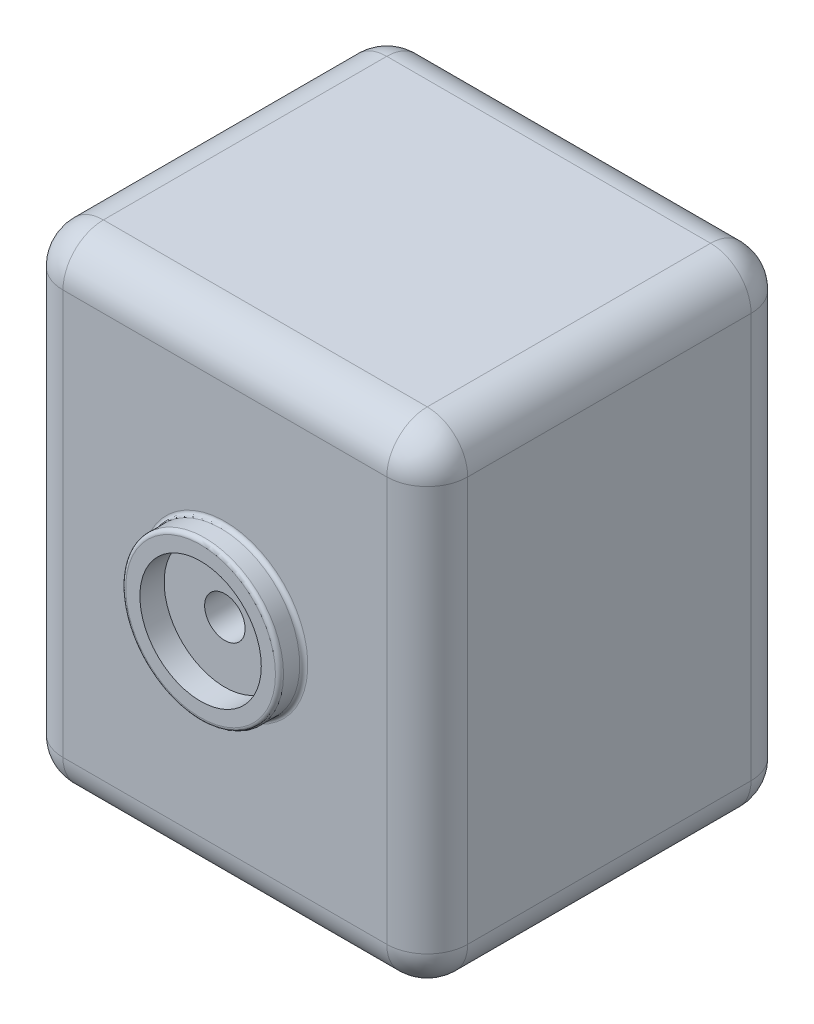
ISO-10303-21;
HEADER;
FILE_DESCRIPTION(('STEP AP214'),'2;1');
FILE_NAME('part.step','',(''),(''),'','','');
FILE_SCHEMA(('AUTOMOTIVE_DESIGN { 1 0 10303 214 1 1 1 1 }'));
ENDSEC;
DATA;
#1=APPLICATION_CONTEXT('core data for automotive mechanical design processes');
#2=APPLICATION_PROTOCOL_DEFINITION('international standard','automotive_design',2000,#1);
#3=PRODUCT_CONTEXT('',#1,'mechanical');
#4=PRODUCT('Part','Part','',(#3));
#5=PRODUCT_RELATED_PRODUCT_CATEGORY('part','',(#4));
#6=PRODUCT_DEFINITION_FORMATION('','',#4);
#7=PRODUCT_DEFINITION_CONTEXT('part definition',#1,'design');
#8=PRODUCT_DEFINITION('design','',#6,#7);
#9=PRODUCT_DEFINITION_SHAPE('','',#8);
#10=(LENGTH_UNIT() NAMED_UNIT(*) SI_UNIT(.MILLI.,.METRE.));
#11=(NAMED_UNIT(*) PLANE_ANGLE_UNIT() SI_UNIT($,.RADIAN.));
#12=(NAMED_UNIT(*) SI_UNIT($,.STERADIAN.) SOLID_ANGLE_UNIT());
#13=UNCERTAINTY_MEASURE_WITH_UNIT(LENGTH_MEASURE(1.E-05),#10,'distance_accuracy_value','');
#14=(GEOMETRIC_REPRESENTATION_CONTEXT(3) GLOBAL_UNCERTAINTY_ASSIGNED_CONTEXT((#13)) GLOBAL_UNIT_ASSIGNED_CONTEXT((#10,
#11,#12)) REPRESENTATION_CONTEXT('',''));
#15=CARTESIAN_POINT('',(0.,0.,0.));
#16=DIRECTION('',(0.,0.,1.));
#17=DIRECTION('',(1.,0.,0.));
#18=AXIS2_PLACEMENT_3D('',#15,#16,#17);
#19=CARTESIAN_POINT('',(0.,12.,0.));
#20=DIRECTION('',(0.,0.,-1.));
#21=DIRECTION('',(-1.,0.,0.));
#22=AXIS2_PLACEMENT_3D('',#19,#20,#21);
#23=PLANE('',#22);
#24=CARTESIAN_POINT('',(5.,6.,0.));
#25=DIRECTION('',(0.,0.,-1.));
#26=DIRECTION('',(-1.,0.,0.));
#27=AXIS2_PLACEMENT_3D('',#24,#25,#26);
#28=CIRCLE('',#27,2.05);
#29=CARTESIAN_POINT('',(2.95,6.,0.));
#30=VERTEX_POINT('',#29);
#31=EDGE_CURVE('E11',#30,#30,#28,.T.);
#32=ORIENTED_EDGE('',*,*,#31,.T.);
#33=EDGE_LOOP('',(#32));
#34=FACE_BOUND('',#33,.T.);
#35=DIRECTION('',(0.,-1.,0.));
#36=VECTOR('',#35,1.);
#37=CARTESIAN_POINT('',(1.,0.,0.));
#38=LINE('',#37,#36);
#39=CARTESIAN_POINT('',(1.,11.,0.));
#40=VERTEX_POINT('',#39);
#41=CARTESIAN_POINT('',(1.,1.,0.));
#42=VERTEX_POINT('',#41);
#43=EDGE_CURVE('E171',#40,#42,#38,.T.);
#44=ORIENTED_EDGE('',*,*,#43,.T.);
#45=DIRECTION('',(1.,0.,0.));
#46=VECTOR('',#45,1.);
#47=CARTESIAN_POINT('',(10.,1.,0.));
#48=LINE('',#47,#46);
#49=CARTESIAN_POINT('',(9.,1.,0.));
#50=VERTEX_POINT('',#49);
#51=EDGE_CURVE('E173',#42,#50,#48,.T.);
#52=ORIENTED_EDGE('',*,*,#51,.T.);
#53=DIRECTION('',(0.,1.,0.));
#54=VECTOR('',#53,1.);
#55=CARTESIAN_POINT('',(9.,12.,0.));
#56=LINE('',#55,#54);
#57=CARTESIAN_POINT('',(9.,11.,0.));
#58=VERTEX_POINT('',#57);
#59=EDGE_CURVE('E167',#50,#58,#56,.T.);
#60=ORIENTED_EDGE('',*,*,#59,.T.);
#61=DIRECTION('',(-1.,0.,0.));
#62=VECTOR('',#61,1.);
#63=CARTESIAN_POINT('',(0.,11.,0.));
#64=LINE('',#63,#62);
#65=EDGE_CURVE('E169',#58,#40,#64,.T.);
#66=ORIENTED_EDGE('',*,*,#65,.T.);
#67=EDGE_LOOP('',(#44,#52,#60,#66));
#68=FACE_BOUND('',#67,.T.);
#69=ADVANCED_FACE('F33',(#34,#68),#23,.F.);
#70=CARTESIAN_POINT('',(0.,0.,-9.));
#71=DIRECTION('',(-1.,0.,0.));
#72=DIRECTION('',(0.,0.,1.));
#73=AXIS2_PLACEMENT_3D('',#70,#71,#72);
#74=PLANE('',#73);
#75=DIRECTION('',(0.,-1.,0.));
#76=VECTOR('',#75,1.);
#77=CARTESIAN_POINT('',(0.,0.,-8.));
#78=LINE('',#77,#76);
#79=CARTESIAN_POINT('',(0.,11.,-8.));
#80=VERTEX_POINT('',#79);
#81=CARTESIAN_POINT('',(0.,1.,-8.));
#82=VERTEX_POINT('',#81);
#83=EDGE_CURVE('E180',#80,#82,#78,.T.);
#84=ORIENTED_EDGE('',*,*,#83,.T.);
#85=DIRECTION('',(0.,0.,1.));
#86=VECTOR('',#85,1.);
#87=CARTESIAN_POINT('',(0.,1.,-9.));
#88=LINE('',#87,#86);
#89=CARTESIAN_POINT('',(0.,1.,-1.));
#90=VERTEX_POINT('',#89);
#91=EDGE_CURVE('E182',#82,#90,#88,.T.);
#92=ORIENTED_EDGE('',*,*,#91,.T.);
#93=DIRECTION('',(0.,-1.,0.));
#94=VECTOR('',#93,1.);
#95=CARTESIAN_POINT('',(0.,12.,-1.));
#96=LINE('',#95,#94);
#97=CARTESIAN_POINT('',(0.,11.,-1.));
#98=VERTEX_POINT('',#97);
#99=EDGE_CURVE('E178',#90,#98,#96,.F.);
#100=ORIENTED_EDGE('',*,*,#99,.T.);
#101=DIRECTION('',(0.,0.,1.));
#102=VECTOR('',#101,1.);
#103=CARTESIAN_POINT('',(0.,11.,-9.));
#104=LINE('',#103,#102);
#105=EDGE_CURVE('E176',#98,#80,#104,.F.);
#106=ORIENTED_EDGE('',*,*,#105,.T.);
#107=EDGE_LOOP('',(#84,#92,#100,#106));
#108=FACE_BOUND('',#107,.T.);
#109=ADVANCED_FACE('F306',(#108),#74,.T.);
#110=CARTESIAN_POINT('',(0.,12.,-9.));
#111=DIRECTION('',(0.,1.,0.));
#112=DIRECTION('',(0.,0.,1.));
#113=AXIS2_PLACEMENT_3D('',#110,#111,#112);
#114=PLANE('',#113);
#115=DIRECTION('',(-1.,0.,0.));
#116=VECTOR('',#115,1.);
#117=CARTESIAN_POINT('',(0.,12.,-8.));
#118=LINE('',#117,#116);
#119=CARTESIAN_POINT('',(9.,12.,-8.));
#120=VERTEX_POINT('',#119);
#121=CARTESIAN_POINT('',(1.,12.,-8.));
#122=VERTEX_POINT('',#121);
#123=EDGE_CURVE('E189',#120,#122,#118,.T.);
#124=ORIENTED_EDGE('',*,*,#123,.T.);
#125=DIRECTION('',(0.,0.,1.));
#126=VECTOR('',#125,1.);
#127=CARTESIAN_POINT('',(1.,12.,-9.));
#128=LINE('',#127,#126);
#129=CARTESIAN_POINT('',(1.,12.,-1.));
#130=VERTEX_POINT('',#129);
#131=EDGE_CURVE('E191',#122,#130,#128,.T.);
#132=ORIENTED_EDGE('',*,*,#131,.T.);
#133=DIRECTION('',(-1.,0.,0.));
#134=VECTOR('',#133,1.);
#135=CARTESIAN_POINT('',(10.,12.,-1.));
#136=LINE('',#135,#134);
#137=CARTESIAN_POINT('',(9.,12.,-1.));
#138=VERTEX_POINT('',#137);
#139=EDGE_CURVE('E187',#130,#138,#136,.F.);
#140=ORIENTED_EDGE('',*,*,#139,.T.);
#141=DIRECTION('',(0.,0.,1.));
#142=VECTOR('',#141,1.);
#143=CARTESIAN_POINT('',(9.,12.,-9.));
#144=LINE('',#143,#142);
#145=EDGE_CURVE('E185',#138,#120,#144,.F.);
#146=ORIENTED_EDGE('',*,*,#145,.T.);
#147=EDGE_LOOP('',(#124,#132,#140,#146));
#148=FACE_BOUND('',#147,.T.);
#149=ADVANCED_FACE('F314',(#148),#114,.T.);
#150=CARTESIAN_POINT('',(10.,0.,-9.));
#151=DIRECTION('',(1.,0.,0.));
#152=DIRECTION('',(0.,0.,-1.));
#153=AXIS2_PLACEMENT_3D('',#150,#151,#152);
#154=PLANE('',#153);
#155=DIRECTION('',(0.,1.,0.));
#156=VECTOR('',#155,1.);
#157=CARTESIAN_POINT('',(10.,0.,-8.));
#158=LINE('',#157,#156);
#159=CARTESIAN_POINT('',(10.,1.,-8.));
#160=VERTEX_POINT('',#159);
#161=CARTESIAN_POINT('',(10.,11.,-8.));
#162=VERTEX_POINT('',#161);
#163=EDGE_CURVE('E48',#160,#162,#158,.T.);
#164=ORIENTED_EDGE('',*,*,#163,.T.);
#165=DIRECTION('',(0.,0.,1.));
#166=VECTOR('',#165,1.);
#167=CARTESIAN_POINT('',(10.,11.,-9.));
#168=LINE('',#167,#166);
#169=CARTESIAN_POINT('',(10.,11.,-1.));
#170=VERTEX_POINT('',#169);
#171=EDGE_CURVE('E198',#162,#170,#168,.T.);
#172=ORIENTED_EDGE('',*,*,#171,.T.);
#173=DIRECTION('',(0.,1.,0.));
#174=VECTOR('',#173,1.);
#175=CARTESIAN_POINT('',(10.,0.,-1.));
#176=LINE('',#175,#174);
#177=CARTESIAN_POINT('',(10.,1.,-1.));
#178=VERTEX_POINT('',#177);
#179=EDGE_CURVE('E194',#170,#178,#176,.F.);
#180=ORIENTED_EDGE('',*,*,#179,.T.);
#181=DIRECTION('',(0.,0.,1.));
#182=VECTOR('',#181,1.);
#183=CARTESIAN_POINT('',(10.,1.,-9.));
#184=LINE('',#183,#182);
#185=EDGE_CURVE('E53',#178,#160,#184,.F.);
#186=ORIENTED_EDGE('',*,*,#185,.T.);
#187=EDGE_LOOP('',(#164,#172,#180,#186));
#188=FACE_BOUND('',#187,.T.);
#189=ADVANCED_FACE('F324',(#188),#154,.T.);
#190=CARTESIAN_POINT('',(0.,0.,-9.));
#191=DIRECTION('',(0.,-1.,0.));
#192=DIRECTION('',(0.,0.,-1.));
#193=AXIS2_PLACEMENT_3D('',#190,#191,#192);
#194=PLANE('',#193);
#195=DIRECTION('',(1.,0.,0.));
#196=VECTOR('',#195,1.);
#197=CARTESIAN_POINT('',(0.,0.,-1.));
#198=LINE('',#197,#196);
#199=CARTESIAN_POINT('',(9.,0.,-1.));
#200=VERTEX_POINT('',#199);
#201=CARTESIAN_POINT('',(1.,0.,-1.));
#202=VERTEX_POINT('',#201);
#203=EDGE_CURVE('E149',#200,#202,#198,.F.);
#204=ORIENTED_EDGE('',*,*,#203,.T.);
#205=DIRECTION('',(0.,0.,1.));
#206=VECTOR('',#205,1.);
#207=CARTESIAN_POINT('',(1.,0.,-9.));
#208=LINE('',#207,#206);
#209=CARTESIAN_POINT('',(1.,0.,-8.));
#210=VERTEX_POINT('',#209);
#211=EDGE_CURVE('E154',#202,#210,#208,.F.);
#212=ORIENTED_EDGE('',*,*,#211,.T.);
#213=DIRECTION('',(1.,0.,0.));
#214=VECTOR('',#213,1.);
#215=CARTESIAN_POINT('',(0.,0.,-8.));
#216=LINE('',#215,#214);
#217=CARTESIAN_POINT('',(9.,0.,-8.));
#218=VERTEX_POINT('',#217);
#219=EDGE_CURVE('E126',#210,#218,#216,.T.);
#220=ORIENTED_EDGE('',*,*,#219,.T.);
#221=DIRECTION('',(0.,0.,1.));
#222=VECTOR('',#221,1.);
#223=CARTESIAN_POINT('',(9.,0.,-9.));
#224=LINE('',#223,#222);
#225=EDGE_CURVE('E143',#218,#200,#224,.T.);
#226=ORIENTED_EDGE('',*,*,#225,.T.);
#227=EDGE_LOOP('',(#204,#212,#220,#226));
#228=FACE_BOUND('',#227,.T.);
#229=ADVANCED_FACE('F152',(#228),#194,.T.);
#230=CARTESIAN_POINT('',(0.,12.,-9.));
#231=DIRECTION('',(0.,0.,-1.));
#232=DIRECTION('',(-1.,0.,0.));
#233=AXIS2_PLACEMENT_3D('',#230,#231,#232);
#234=PLANE('',#233);
#235=DIRECTION('',(0.,1.,0.));
#236=VECTOR('',#235,1.);
#237=CARTESIAN_POINT('',(9.,12.,-9.));
#238=LINE('',#237,#236);
#239=CARTESIAN_POINT('',(9.,11.,-9.));
#240=VERTEX_POINT('',#239);
#241=CARTESIAN_POINT('',(9.,1.,-9.));
#242=VERTEX_POINT('',#241);
#243=EDGE_CURVE('E157',#240,#242,#238,.F.);
#244=ORIENTED_EDGE('',*,*,#243,.T.);
#245=DIRECTION('',(1.,0.,0.));
#246=VECTOR('',#245,1.);
#247=CARTESIAN_POINT('',(0.,1.,-9.));
#248=LINE('',#247,#246);
#249=CARTESIAN_POINT('',(1.,1.,-9.));
#250=VERTEX_POINT('',#249);
#251=EDGE_CURVE('E128',#242,#250,#248,.F.);
#252=ORIENTED_EDGE('',*,*,#251,.T.);
#253=DIRECTION('',(0.,-1.,0.));
#254=VECTOR('',#253,1.);
#255=CARTESIAN_POINT('',(1.,12.,-9.));
#256=LINE('',#255,#254);
#257=CARTESIAN_POINT('',(1.,11.,-9.));
#258=VERTEX_POINT('',#257);
#259=EDGE_CURVE('E164',#250,#258,#256,.F.);
#260=ORIENTED_EDGE('',*,*,#259,.T.);
#261=DIRECTION('',(-1.,0.,0.));
#262=VECTOR('',#261,1.);
#263=CARTESIAN_POINT('',(0.,11.,-9.));
#264=LINE('',#263,#262);
#265=EDGE_CURVE('E162',#258,#240,#264,.F.);
#266=ORIENTED_EDGE('',*,*,#265,.T.);
#267=EDGE_LOOP('',(#244,#252,#260,#266));
#268=FACE_BOUND('',#267,.T.);
#269=CARTESIAN_POINT('',(5.,6.,-9.));
#270=DIRECTION('',(0.,0.,1.));
#271=DIRECTION('',(1.,0.,0.));
#272=AXIS2_PLACEMENT_3D('',#269,#270,#271);
#273=CIRCLE('',#272,0.5);
#274=CARTESIAN_POINT('',(5.5,6.,-9.));
#275=VERTEX_POINT('',#274);
#276=EDGE_CURVE('E282',#275,#275,#273,.T.);
#277=ORIENTED_EDGE('',*,*,#276,.T.);
#278=EDGE_LOOP('',(#277));
#279=FACE_BOUND('',#278,.T.);
#280=ADVANCED_FACE('F320',(#268,#279),#234,.T.);
#281=CARTESIAN_POINT('',(5.,6.,0.6));
#282=DIRECTION('',(0.,0.,-1.));
#283=DIRECTION('',(-1.,0.,0.));
#284=AXIS2_PLACEMENT_3D('',#281,#282,#283);
#285=CYLINDRICAL_SURFACE('',#284,1.95);
#286=CARTESIAN_POINT('',(5.,6.,0.5));
#287=DIRECTION('',(0.,0.,1.));
#288=DIRECTION('',(1.,0.,0.));
#289=AXIS2_PLACEMENT_3D('',#286,#287,#288);
#290=CIRCLE('',#289,1.95);
#291=CARTESIAN_POINT('',(6.95,6.,0.5));
#292=VERTEX_POINT('',#291);
#293=EDGE_CURVE('E41',#292,#292,#290,.F.);
#294=ORIENTED_EDGE('',*,*,#293,.T.);
#295=EDGE_LOOP('',(#294));
#296=FACE_BOUND('',#295,.T.);
#297=CARTESIAN_POINT('',(5.,6.,0.1));
#298=DIRECTION('',(0.,0.,-1.));
#299=DIRECTION('',(-1.,0.,0.));
#300=AXIS2_PLACEMENT_3D('',#297,#298,#299);
#301=CIRCLE('',#300,1.95);
#302=CARTESIAN_POINT('',(3.05,6.,0.1));
#303=VERTEX_POINT('',#302);
#304=EDGE_CURVE('E260',#303,#303,#301,.F.);
#305=ORIENTED_EDGE('',*,*,#304,.T.);
#306=EDGE_LOOP('',(#305));
#307=FACE_BOUND('',#306,.T.);
#308=ADVANCED_FACE('F265',(#296,#307),#285,.T.);
#309=CARTESIAN_POINT('',(5.,6.,0.6));
#310=DIRECTION('',(0.,0.,1.));
#311=DIRECTION('',(1.,0.,0.));
#312=AXIS2_PLACEMENT_3D('',#309,#310,#311);
#313=PLANE('',#312);
#314=CARTESIAN_POINT('',(5.,6.,0.6));
#315=DIRECTION('',(0.,0.,1.));
#316=DIRECTION('',(1.,0.,0.));
#317=AXIS2_PLACEMENT_3D('',#314,#315,#316);
#318=CIRCLE('',#317,1.85);
#319=CARTESIAN_POINT('',(6.85,6.,0.6));
#320=VERTEX_POINT('',#319);
#321=EDGE_CURVE('E199',#320,#320,#318,.T.);
#322=ORIENTED_EDGE('',*,*,#321,.T.);
#323=EDGE_LOOP('',(#322));
#324=FACE_BOUND('',#323,.T.);
#325=CARTESIAN_POINT('',(5.,6.,0.6));
#326=DIRECTION('',(0.,0.,1.));
#327=DIRECTION('',(1.,0.,0.));
#328=AXIS2_PLACEMENT_3D('',#325,#326,#327);
#329=CIRCLE('',#328,1.5);
#330=CARTESIAN_POINT('',(6.5,6.,0.6));
#331=VERTEX_POINT('',#330);
#332=EDGE_CURVE('E280',#331,#331,#329,.T.);
#333=ORIENTED_EDGE('',*,*,#332,.F.);
#334=EDGE_LOOP('',(#333));
#335=FACE_BOUND('',#334,.T.);
#336=ADVANCED_FACE('F273',(#324,#335),#313,.T.);
#337=CARTESIAN_POINT('',(5.,6.,0.));
#338=DIRECTION('',(0.,0.,1.));
#339=DIRECTION('',(1.,0.,0.));
#340=AXIS2_PLACEMENT_3D('',#337,#338,#339);
#341=CYLINDRICAL_SURFACE('',#340,1.5);
#342=CARTESIAN_POINT('',(5.,6.,0.));
#343=DIRECTION('',(0.,0.,1.));
#344=DIRECTION('',(1.,0.,0.));
#345=AXIS2_PLACEMENT_3D('',#342,#343,#344);
#346=CIRCLE('',#345,1.5);
#347=CARTESIAN_POINT('',(6.5,6.,0.));
#348=VERTEX_POINT('',#347);
#349=EDGE_CURVE('E150',#348,#348,#346,.T.);
#350=ORIENTED_EDGE('',*,*,#349,.F.);
#351=EDGE_LOOP('',(#350));
#352=FACE_BOUND('',#351,.T.);
#353=ORIENTED_EDGE('',*,*,#332,.T.);
#354=EDGE_LOOP('',(#353));
#355=FACE_BOUND('',#354,.T.);
#356=ADVANCED_FACE('F276',(#352,#355),#341,.F.);
#357=CARTESIAN_POINT('',(5.,6.,0.));
#358=DIRECTION('',(0.,0.,1.));
#359=DIRECTION('',(1.,0.,0.));
#360=AXIS2_PLACEMENT_3D('',#357,#358,#359);
#361=PLANE('',#360);
#362=CARTESIAN_POINT('',(5.,6.,0.));
#363=DIRECTION('',(0.,0.,1.));
#364=DIRECTION('',(1.,0.,0.));
#365=AXIS2_PLACEMENT_3D('',#362,#363,#364);
#366=CIRCLE('',#365,0.5);
#367=CARTESIAN_POINT('',(5.5,6.,0.));
#368=VERTEX_POINT('',#367);
#369=EDGE_CURVE('E257',#368,#368,#366,.T.);
#370=ORIENTED_EDGE('',*,*,#369,.F.);
#371=EDGE_LOOP('',(#370));
#372=FACE_BOUND('',#371,.T.);
#373=ORIENTED_EDGE('',*,*,#349,.T.);
#374=EDGE_LOOP('',(#373));
#375=FACE_BOUND('',#374,.T.);
#376=ADVANCED_FACE('F294',(#372,#375),#361,.T.);
#377=CARTESIAN_POINT('',(5.,6.,-9.));
#378=DIRECTION('',(0.,0.,1.));
#379=DIRECTION('',(1.,0.,0.));
#380=AXIS2_PLACEMENT_3D('',#377,#378,#379);
#381=CYLINDRICAL_SURFACE('',#380,0.5);
#382=ORIENTED_EDGE('',*,*,#276,.F.);
#383=EDGE_LOOP('',(#382));
#384=FACE_BOUND('',#383,.T.);
#385=ORIENTED_EDGE('',*,*,#369,.T.);
#386=EDGE_LOOP('',(#385));
#387=FACE_BOUND('',#386,.T.);
#388=ADVANCED_FACE('F292',(#384,#387),#381,.F.);
#389=CARTESIAN_POINT('',(0.,11.,-1.));
#390=DIRECTION('',(1.,0.,0.));
#391=DIRECTION('',(0.,0.,-1.));
#392=AXIS2_PLACEMENT_3D('',#389,#390,#391);
#393=CYLINDRICAL_SURFACE('',#392,1.);
#394=CARTESIAN_POINT('',(1.,11.,-1.));
#395=DIRECTION('',(-1.,0.,0.));
#396=DIRECTION('',(0.,0.,1.));
#397=AXIS2_PLACEMENT_3D('',#394,#395,#396);
#398=CIRCLE('',#397,1.);
#399=EDGE_CURVE('E254',#40,#130,#398,.T.);
#400=ORIENTED_EDGE('',*,*,#399,.F.);
#401=ORIENTED_EDGE('',*,*,#65,.F.);
#402=CARTESIAN_POINT('',(9.,11.,-1.));
#403=DIRECTION('',(1.,0.,0.));
#404=DIRECTION('',(0.,0.,-1.));
#405=AXIS2_PLACEMENT_3D('',#402,#403,#404);
#406=CIRCLE('',#405,1.);
#407=EDGE_CURVE('E251',#138,#58,#406,.T.);
#408=ORIENTED_EDGE('',*,*,#407,.F.);
#409=ORIENTED_EDGE('',*,*,#139,.F.);
#410=EDGE_LOOP('',(#400,#401,#408,#409));
#411=FACE_BOUND('',#410,.T.);
#412=ADVANCED_FACE('F399',(#411),#393,.T.);
#413=CARTESIAN_POINT('',(1.,11.,-1.));
#414=DIRECTION('',(0.,0.,1.));
#415=DIRECTION('',(1.,0.,0.));
#416=AXIS2_PLACEMENT_3D('',#413,#414,#415);
#417=SPHERICAL_SURFACE('',#416,1.);
#418=CARTESIAN_POINT('',(1.,11.,-1.));
#419=DIRECTION('',(0.,1.,0.));
#420=DIRECTION('',(0.,0.,1.));
#421=AXIS2_PLACEMENT_3D('',#418,#419,#420);
#422=CIRCLE('',#421,1.);
#423=EDGE_CURVE('E246',#40,#98,#422,.F.);
#424=ORIENTED_EDGE('',*,*,#423,.F.);
#425=ORIENTED_EDGE('',*,*,#399,.T.);
#426=CARTESIAN_POINT('',(1.,11.,-1.));
#427=DIRECTION('',(0.,0.,1.));
#428=DIRECTION('',(1.,0.,0.));
#429=AXIS2_PLACEMENT_3D('',#426,#427,#428);
#430=CIRCLE('',#429,1.);
#431=EDGE_CURVE('E249',#98,#130,#430,.F.);
#432=ORIENTED_EDGE('',*,*,#431,.F.);
#433=EDGE_LOOP('',(#424,#425,#432));
#434=FACE_BOUND('',#433,.T.);
#435=ADVANCED_FACE('F395',(#434),#417,.T.);
#436=CARTESIAN_POINT('',(9.,11.,-1.));
#437=DIRECTION('',(0.,0.,1.));
#438=DIRECTION('',(1.,0.,0.));
#439=AXIS2_PLACEMENT_3D('',#436,#437,#438);
#440=SPHERICAL_SURFACE('',#439,1.);
#441=CARTESIAN_POINT('',(9.,11.,-1.));
#442=DIRECTION('',(0.,0.,1.));
#443=DIRECTION('',(1.,0.,0.));
#444=AXIS2_PLACEMENT_3D('',#441,#442,#443);
#445=CIRCLE('',#444,1.);
#446=EDGE_CURVE('E240',#138,#170,#445,.F.);
#447=ORIENTED_EDGE('',*,*,#446,.F.);
#448=ORIENTED_EDGE('',*,*,#407,.T.);
#449=CARTESIAN_POINT('',(9.,11.,-1.));
#450=DIRECTION('',(0.,1.,0.));
#451=DIRECTION('',(0.,0.,1.));
#452=AXIS2_PLACEMENT_3D('',#449,#450,#451);
#453=CIRCLE('',#452,1.);
#454=EDGE_CURVE('E243',#170,#58,#453,.F.);
#455=ORIENTED_EDGE('',*,*,#454,.F.);
#456=EDGE_LOOP('',(#447,#448,#455));
#457=FACE_BOUND('',#456,.T.);
#458=ADVANCED_FACE('F391',(#457),#440,.T.);
#459=CARTESIAN_POINT('',(1.,11.,-9.));
#460=DIRECTION('',(0.,0.,1.));
#461=DIRECTION('',(1.,0.,0.));
#462=AXIS2_PLACEMENT_3D('',#459,#460,#461);
#463=CYLINDRICAL_SURFACE('',#462,1.);
#464=ORIENTED_EDGE('',*,*,#431,.T.);
#465=ORIENTED_EDGE('',*,*,#131,.F.);
#466=CARTESIAN_POINT('',(1.,11.,-8.));
#467=DIRECTION('',(0.,0.,-1.));
#468=DIRECTION('',(-1.,0.,0.));
#469=AXIS2_PLACEMENT_3D('',#466,#467,#468);
#470=CIRCLE('',#469,1.);
#471=EDGE_CURVE('E234',#80,#122,#470,.T.);
#472=ORIENTED_EDGE('',*,*,#471,.F.);
#473=ORIENTED_EDGE('',*,*,#105,.F.);
#474=EDGE_LOOP('',(#464,#465,#472,#473));
#475=FACE_BOUND('',#474,.T.);
#476=ADVANCED_FACE('F387',(#475),#463,.T.);
#477=CARTESIAN_POINT('',(1.,12.,-1.));
#478=DIRECTION('',(0.,1.,0.));
#479=DIRECTION('',(0.,0.,1.));
#480=AXIS2_PLACEMENT_3D('',#477,#478,#479);
#481=CYLINDRICAL_SURFACE('',#480,1.);
#482=ORIENTED_EDGE('',*,*,#423,.T.);
#483=ORIENTED_EDGE('',*,*,#99,.F.);
#484=CARTESIAN_POINT('',(1.,1.,-1.));
#485=DIRECTION('',(0.,-1.,0.));
#486=DIRECTION('',(1.,0.,0.));
#487=AXIS2_PLACEMENT_3D('',#484,#485,#486);
#488=CIRCLE('',#487,1.);
#489=EDGE_CURVE('E231',#42,#90,#488,.T.);
#490=ORIENTED_EDGE('',*,*,#489,.F.);
#491=ORIENTED_EDGE('',*,*,#43,.F.);
#492=EDGE_LOOP('',(#482,#483,#490,#491));
#493=FACE_BOUND('',#492,.T.);
#494=ADVANCED_FACE('F383',(#493),#481,.T.);
#495=CARTESIAN_POINT('',(0.,1.,-1.));
#496=DIRECTION('',(-1.,0.,0.));
#497=DIRECTION('',(0.,0.,1.));
#498=AXIS2_PLACEMENT_3D('',#495,#496,#497);
#499=CYLINDRICAL_SURFACE('',#498,1.);
#500=CARTESIAN_POINT('',(9.,1.,-1.));
#501=DIRECTION('',(1.,0.,0.));
#502=DIRECTION('',(0.,0.,-1.));
#503=AXIS2_PLACEMENT_3D('',#500,#501,#502);
#504=CIRCLE('',#503,1.);
#505=EDGE_CURVE('E225',#50,#200,#504,.T.);
#506=ORIENTED_EDGE('',*,*,#505,.F.);
#507=ORIENTED_EDGE('',*,*,#51,.F.);
#508=CARTESIAN_POINT('',(1.,1.,-1.));
#509=DIRECTION('',(-1.,0.,0.));
#510=DIRECTION('',(0.,0.,1.));
#511=AXIS2_PLACEMENT_3D('',#508,#509,#510);
#512=CIRCLE('',#511,1.);
#513=EDGE_CURVE('E228',#202,#42,#512,.T.);
#514=ORIENTED_EDGE('',*,*,#513,.F.);
#515=ORIENTED_EDGE('',*,*,#203,.F.);
#516=EDGE_LOOP('',(#506,#507,#514,#515));
#517=FACE_BOUND('',#516,.T.);
#518=ADVANCED_FACE('F379',(#517),#499,.T.);
#519=CARTESIAN_POINT('',(9.,12.,-1.));
#520=DIRECTION('',(0.,-1.,0.));
#521=DIRECTION('',(0.,0.,-1.));
#522=AXIS2_PLACEMENT_3D('',#519,#520,#521);
#523=CYLINDRICAL_SURFACE('',#522,1.);
#524=ORIENTED_EDGE('',*,*,#454,.T.);
#525=ORIENTED_EDGE('',*,*,#59,.F.);
#526=CARTESIAN_POINT('',(9.,1.,-1.));
#527=DIRECTION('',(0.,-1.,0.));
#528=DIRECTION('',(0.,0.,-1.));
#529=AXIS2_PLACEMENT_3D('',#526,#527,#528);
#530=CIRCLE('',#529,1.);
#531=EDGE_CURVE('E223',#178,#50,#530,.T.);
#532=ORIENTED_EDGE('',*,*,#531,.F.);
#533=ORIENTED_EDGE('',*,*,#179,.F.);
#534=EDGE_LOOP('',(#524,#525,#532,#533));
#535=FACE_BOUND('',#534,.T.);
#536=ADVANCED_FACE('F375',(#535),#523,.T.);
#537=CARTESIAN_POINT('',(9.,11.,-9.));
#538=DIRECTION('',(0.,0.,1.));
#539=DIRECTION('',(1.,0.,0.));
#540=AXIS2_PLACEMENT_3D('',#537,#538,#539);
#541=CYLINDRICAL_SURFACE('',#540,1.);
#542=ORIENTED_EDGE('',*,*,#446,.T.);
#543=ORIENTED_EDGE('',*,*,#171,.F.);
#544=CARTESIAN_POINT('',(9.,11.,-8.));
#545=DIRECTION('',(0.,0.,-1.));
#546=DIRECTION('',(-1.,0.,0.));
#547=AXIS2_PLACEMENT_3D('',#544,#545,#546);
#548=CIRCLE('',#547,1.);
#549=EDGE_CURVE('E220',#120,#162,#548,.T.);
#550=ORIENTED_EDGE('',*,*,#549,.F.);
#551=ORIENTED_EDGE('',*,*,#145,.F.);
#552=EDGE_LOOP('',(#542,#543,#550,#551));
#553=FACE_BOUND('',#552,.T.);
#554=ADVANCED_FACE('F371',(#553),#541,.T.);
#555=CARTESIAN_POINT('',(0.,11.,-8.));
#556=DIRECTION('',(-1.,0.,0.));
#557=DIRECTION('',(0.,0.,1.));
#558=AXIS2_PLACEMENT_3D('',#555,#556,#557);
#559=CYLINDRICAL_SURFACE('',#558,1.);
#560=CARTESIAN_POINT('',(1.,11.,-8.));
#561=DIRECTION('',(-1.,0.,0.));
#562=DIRECTION('',(0.,0.,1.));
#563=AXIS2_PLACEMENT_3D('',#560,#561,#562);
#564=CIRCLE('',#563,1.);
#565=EDGE_CURVE('E237',#122,#258,#564,.T.);
#566=ORIENTED_EDGE('',*,*,#565,.F.);
#567=ORIENTED_EDGE('',*,*,#123,.F.);
#568=CARTESIAN_POINT('',(9.,11.,-8.));
#569=DIRECTION('',(1.,0.,0.));
#570=DIRECTION('',(0.,0.,-1.));
#571=AXIS2_PLACEMENT_3D('',#568,#569,#570);
#572=CIRCLE('',#571,1.);
#573=EDGE_CURVE('E217',#240,#120,#572,.T.);
#574=ORIENTED_EDGE('',*,*,#573,.F.);
#575=ORIENTED_EDGE('',*,*,#265,.F.);
#576=EDGE_LOOP('',(#566,#567,#574,#575));
#577=FACE_BOUND('',#576,.T.);
#578=ADVANCED_FACE('F367',(#577),#559,.T.);
#579=CARTESIAN_POINT('',(1.,11.,-8.));
#580=DIRECTION('',(0.,0.,1.));
#581=DIRECTION('',(1.,0.,0.));
#582=AXIS2_PLACEMENT_3D('',#579,#580,#581);
#583=SPHERICAL_SURFACE('',#582,1.);
#584=ORIENTED_EDGE('',*,*,#471,.T.);
#585=ORIENTED_EDGE('',*,*,#565,.T.);
#586=CARTESIAN_POINT('',(1.,11.,-8.));
#587=DIRECTION('',(0.,1.,0.));
#588=DIRECTION('',(0.,0.,1.));
#589=AXIS2_PLACEMENT_3D('',#586,#587,#588);
#590=CIRCLE('',#589,1.);
#591=EDGE_CURVE('E214',#80,#258,#590,.F.);
#592=ORIENTED_EDGE('',*,*,#591,.F.);
#593=EDGE_LOOP('',(#584,#585,#592));
#594=FACE_BOUND('',#593,.T.);
#595=ADVANCED_FACE('F363',(#594),#583,.T.);
#596=CARTESIAN_POINT('',(1.,1.,-1.));
#597=DIRECTION('',(0.,0.,1.));
#598=DIRECTION('',(1.,0.,0.));
#599=AXIS2_PLACEMENT_3D('',#596,#597,#598);
#600=SPHERICAL_SURFACE('',#599,1.);
#601=ORIENTED_EDGE('',*,*,#513,.T.);
#602=ORIENTED_EDGE('',*,*,#489,.T.);
#603=CARTESIAN_POINT('',(1.,1.,-1.));
#604=DIRECTION('',(0.,0.,1.));
#605=DIRECTION('',(1.,0.,0.));
#606=AXIS2_PLACEMENT_3D('',#603,#604,#605);
#607=CIRCLE('',#606,1.);
#608=EDGE_CURVE('E212',#202,#90,#607,.F.);
#609=ORIENTED_EDGE('',*,*,#608,.F.);
#610=EDGE_LOOP('',(#601,#602,#609));
#611=FACE_BOUND('',#610,.T.);
#612=ADVANCED_FACE('F359',(#611),#600,.T.);
#613=CARTESIAN_POINT('',(9.,1.,-1.));
#614=DIRECTION('',(0.,0.,1.));
#615=DIRECTION('',(1.,0.,0.));
#616=AXIS2_PLACEMENT_3D('',#613,#614,#615);
#617=SPHERICAL_SURFACE('',#616,1.);
#618=ORIENTED_EDGE('',*,*,#531,.T.);
#619=ORIENTED_EDGE('',*,*,#505,.T.);
#620=CARTESIAN_POINT('',(9.,1.,-1.));
#621=DIRECTION('',(0.,0.,1.));
#622=DIRECTION('',(1.,0.,0.));
#623=AXIS2_PLACEMENT_3D('',#620,#621,#622);
#624=CIRCLE('',#623,1.);
#625=EDGE_CURVE('E146',#178,#200,#624,.F.);
#626=ORIENTED_EDGE('',*,*,#625,.F.);
#627=EDGE_LOOP('',(#618,#619,#626));
#628=FACE_BOUND('',#627,.T.);
#629=ADVANCED_FACE('F355',(#628),#617,.T.);
#630=CARTESIAN_POINT('',(9.,11.,-8.));
#631=DIRECTION('',(0.,0.,1.));
#632=DIRECTION('',(1.,0.,0.));
#633=AXIS2_PLACEMENT_3D('',#630,#631,#632);
#634=SPHERICAL_SURFACE('',#633,1.);
#635=ORIENTED_EDGE('',*,*,#573,.T.);
#636=ORIENTED_EDGE('',*,*,#549,.T.);
#637=CARTESIAN_POINT('',(9.,11.,-8.));
#638=DIRECTION('',(0.,1.,0.));
#639=DIRECTION('',(0.,0.,1.));
#640=AXIS2_PLACEMENT_3D('',#637,#638,#639);
#641=CIRCLE('',#640,1.);
#642=EDGE_CURVE('E208',#240,#162,#641,.F.);
#643=ORIENTED_EDGE('',*,*,#642,.F.);
#644=EDGE_LOOP('',(#635,#636,#643));
#645=FACE_BOUND('',#644,.T.);
#646=ADVANCED_FACE('F351',(#645),#634,.T.);
#647=CARTESIAN_POINT('',(1.,0.,-8.));
#648=DIRECTION('',(0.,-1.,0.));
#649=DIRECTION('',(0.,0.,-1.));
#650=AXIS2_PLACEMENT_3D('',#647,#648,#649);
#651=CYLINDRICAL_SURFACE('',#650,1.);
#652=ORIENTED_EDGE('',*,*,#591,.T.);
#653=ORIENTED_EDGE('',*,*,#259,.F.);
#654=CARTESIAN_POINT('',(1.,1.,-8.));
#655=DIRECTION('',(0.,-1.,0.));
#656=DIRECTION('',(0.,0.,-1.));
#657=AXIS2_PLACEMENT_3D('',#654,#655,#656);
#658=CIRCLE('',#657,1.);
#659=EDGE_CURVE('E205',#82,#250,#658,.T.);
#660=ORIENTED_EDGE('',*,*,#659,.F.);
#661=ORIENTED_EDGE('',*,*,#83,.F.);
#662=EDGE_LOOP('',(#652,#653,#660,#661));
#663=FACE_BOUND('',#662,.T.);
#664=ADVANCED_FACE('F347',(#663),#651,.T.);
#665=CARTESIAN_POINT('',(1.,1.,-9.));
#666=DIRECTION('',(0.,0.,1.));
#667=DIRECTION('',(1.,0.,0.));
#668=AXIS2_PLACEMENT_3D('',#665,#666,#667);
#669=CYLINDRICAL_SURFACE('',#668,1.);
#670=ORIENTED_EDGE('',*,*,#608,.T.);
#671=ORIENTED_EDGE('',*,*,#91,.F.);
#672=CARTESIAN_POINT('',(1.,1.,-8.));
#673=DIRECTION('',(0.,0.,-1.));
#674=DIRECTION('',(-1.,0.,0.));
#675=AXIS2_PLACEMENT_3D('',#672,#673,#674);
#676=CIRCLE('',#675,1.);
#677=EDGE_CURVE('E140',#210,#82,#676,.T.);
#678=ORIENTED_EDGE('',*,*,#677,.F.);
#679=ORIENTED_EDGE('',*,*,#211,.F.);
#680=EDGE_LOOP('',(#670,#671,#678,#679));
#681=FACE_BOUND('',#680,.T.);
#682=ADVANCED_FACE('F344',(#681),#669,.T.);
#683=CARTESIAN_POINT('',(9.,1.,-9.));
#684=DIRECTION('',(0.,0.,1.));
#685=DIRECTION('',(1.,0.,0.));
#686=AXIS2_PLACEMENT_3D('',#683,#684,#685);
#687=CYLINDRICAL_SURFACE('',#686,1.);
#688=ORIENTED_EDGE('',*,*,#625,.T.);
#689=ORIENTED_EDGE('',*,*,#225,.F.);
#690=CARTESIAN_POINT('',(9.,1.,-8.));
#691=DIRECTION('',(0.,0.,-1.));
#692=DIRECTION('',(-1.,0.,0.));
#693=AXIS2_PLACEMENT_3D('',#690,#691,#692);
#694=CIRCLE('',#693,1.);
#695=EDGE_CURVE('E134',#160,#218,#694,.T.);
#696=ORIENTED_EDGE('',*,*,#695,.F.);
#697=ORIENTED_EDGE('',*,*,#185,.F.);
#698=EDGE_LOOP('',(#688,#689,#696,#697));
#699=FACE_BOUND('',#698,.T.);
#700=ADVANCED_FACE('F144',(#699),#687,.T.);
#701=CARTESIAN_POINT('',(9.,0.,-8.));
#702=DIRECTION('',(0.,1.,0.));
#703=DIRECTION('',(0.,0.,1.));
#704=AXIS2_PLACEMENT_3D('',#701,#702,#703);
#705=CYLINDRICAL_SURFACE('',#704,1.);
#706=ORIENTED_EDGE('',*,*,#642,.T.);
#707=ORIENTED_EDGE('',*,*,#163,.F.);
#708=CARTESIAN_POINT('',(9.,1.,-8.));
#709=DIRECTION('',(0.,-1.,0.));
#710=DIRECTION('',(0.,0.,-1.));
#711=AXIS2_PLACEMENT_3D('',#708,#709,#710);
#712=CIRCLE('',#711,1.);
#713=EDGE_CURVE('E138',#242,#160,#712,.T.);
#714=ORIENTED_EDGE('',*,*,#713,.F.);
#715=ORIENTED_EDGE('',*,*,#243,.F.);
#716=EDGE_LOOP('',(#706,#707,#714,#715));
#717=FACE_BOUND('',#716,.T.);
#718=ADVANCED_FACE('F337',(#717),#705,.T.);
#719=CARTESIAN_POINT('',(1.,1.,-8.));
#720=DIRECTION('',(0.,0.,1.));
#721=DIRECTION('',(1.,0.,0.));
#722=AXIS2_PLACEMENT_3D('',#719,#720,#721);
#723=SPHERICAL_SURFACE('',#722,1.);
#724=ORIENTED_EDGE('',*,*,#677,.T.);
#725=ORIENTED_EDGE('',*,*,#659,.T.);
#726=CARTESIAN_POINT('',(1.,1.,-8.));
#727=DIRECTION('',(-1.,0.,0.));
#728=DIRECTION('',(0.,0.,1.));
#729=AXIS2_PLACEMENT_3D('',#726,#727,#728);
#730=CIRCLE('',#729,1.);
#731=EDGE_CURVE('E131',#210,#250,#730,.F.);
#732=ORIENTED_EDGE('',*,*,#731,.F.);
#733=EDGE_LOOP('',(#724,#725,#732));
#734=FACE_BOUND('',#733,.T.);
#735=ADVANCED_FACE('F334',(#734),#723,.T.);
#736=CARTESIAN_POINT('',(9.,1.,-8.));
#737=DIRECTION('',(0.,0.,1.));
#738=DIRECTION('',(1.,0.,0.));
#739=AXIS2_PLACEMENT_3D('',#736,#737,#738);
#740=SPHERICAL_SURFACE('',#739,1.);
#741=ORIENTED_EDGE('',*,*,#713,.T.);
#742=ORIENTED_EDGE('',*,*,#695,.T.);
#743=CARTESIAN_POINT('',(9.,1.,-8.));
#744=DIRECTION('',(1.,0.,0.));
#745=DIRECTION('',(0.,0.,-1.));
#746=AXIS2_PLACEMENT_3D('',#743,#744,#745);
#747=CIRCLE('',#746,1.);
#748=EDGE_CURVE('E122',#242,#218,#747,.F.);
#749=ORIENTED_EDGE('',*,*,#748,.F.);
#750=EDGE_LOOP('',(#741,#742,#749));
#751=FACE_BOUND('',#750,.T.);
#752=ADVANCED_FACE('F136',(#751),#740,.T.);
#753=CARTESIAN_POINT('',(0.,1.,-8.));
#754=DIRECTION('',(1.,0.,0.));
#755=DIRECTION('',(0.,0.,-1.));
#756=AXIS2_PLACEMENT_3D('',#753,#754,#755);
#757=CYLINDRICAL_SURFACE('',#756,1.);
#758=ORIENTED_EDGE('',*,*,#731,.T.);
#759=ORIENTED_EDGE('',*,*,#251,.F.);
#760=ORIENTED_EDGE('',*,*,#748,.T.);
#761=ORIENTED_EDGE('',*,*,#219,.F.);
#762=EDGE_LOOP('',(#758,#759,#760,#761));
#763=FACE_BOUND('',#762,.T.);
#764=ADVANCED_FACE('F124',(#763),#757,.T.);
#765=CARTESIAN_POINT('',(5.,6.,0.5));
#766=DIRECTION('',(0.,0.,1.));
#767=DIRECTION('',(1.,0.,0.));
#768=AXIS2_PLACEMENT_3D('',#765,#766,#767);
#769=TOROIDAL_SURFACE('',#768,1.85,0.1);
#770=ORIENTED_EDGE('',*,*,#293,.F.);
#771=EDGE_LOOP('',(#770));
#772=FACE_BOUND('',#771,.T.);
#773=ORIENTED_EDGE('',*,*,#321,.F.);
#774=EDGE_LOOP('',(#773));
#775=FACE_BOUND('',#774,.T.);
#776=ADVANCED_FACE('F268',(#772,#775),#769,.T.);
#777=CARTESIAN_POINT('',(5.,6.,0.1));
#778=DIRECTION('',(0.,0.,-1.));
#779=DIRECTION('',(-1.,0.,0.));
#780=AXIS2_PLACEMENT_3D('',#777,#778,#779);
#781=TOROIDAL_SURFACE('',#780,2.05,0.1);
#782=ORIENTED_EDGE('',*,*,#31,.F.);
#783=EDGE_LOOP('',(#782));
#784=FACE_BOUND('',#783,.T.);
#785=ORIENTED_EDGE('',*,*,#304,.F.);
#786=EDGE_LOOP('',(#785));
#787=FACE_BOUND('',#786,.T.);
#788=ADVANCED_FACE('F35',(#784,#787),#781,.F.);
#789=CLOSED_SHELL('',(#69,#109,#149,#189,#229,#280,#308,#336,#356,#376,#388,#412,#435,#458,#476,
#494,#518,#536,#554,#578,#595,#612,#629,#646,#664,#682,#700,#718,#735,#752,#764,#776,#788));
#790=MANIFOLD_SOLID_BREP('B2',#789);
#791=ADVANCED_BREP_SHAPE_REPRESENTATION('',(#18,#790),#14);
#792=SHAPE_DEFINITION_REPRESENTATION(#9,#791);
ENDSEC;
END-ISO-10303-21;
